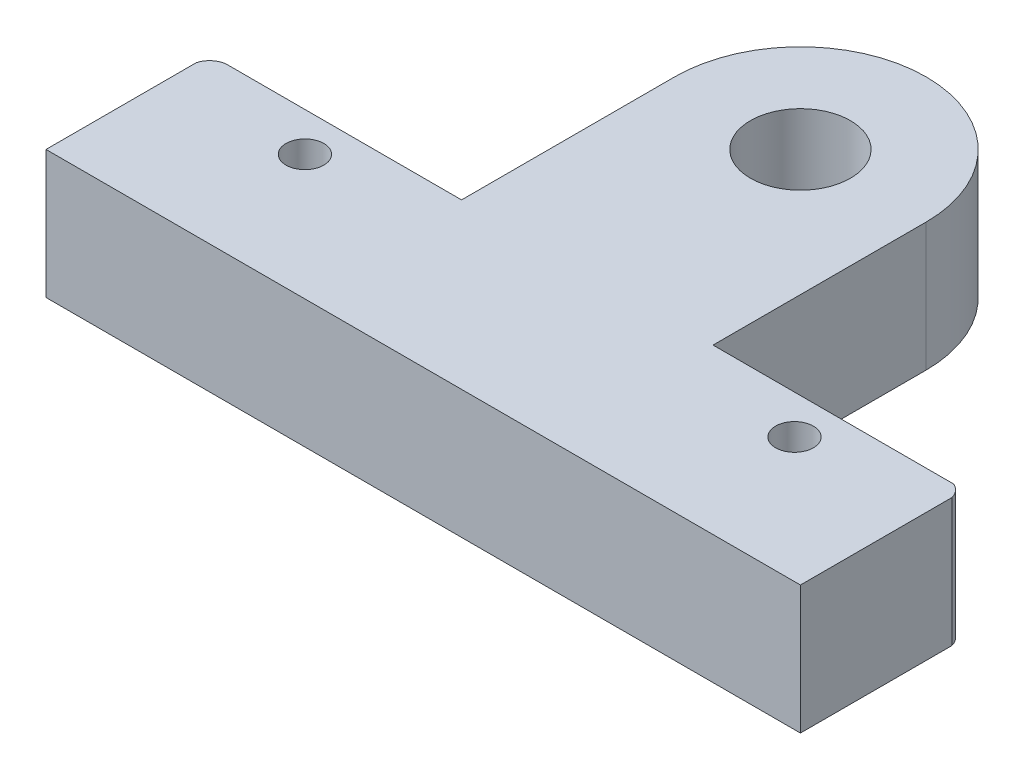
ISO-10303-21;
HEADER;
FILE_DESCRIPTION(('STEP AP214'),'2;1');
FILE_NAME('part.step','',(''),(''),'','','');
FILE_SCHEMA(('AUTOMOTIVE_DESIGN { 1 0 10303 214 1 1 1 1 }'));
ENDSEC;
DATA;
#1=APPLICATION_CONTEXT('core data for automotive mechanical design processes');
#2=APPLICATION_PROTOCOL_DEFINITION('international standard','automotive_design',2000,#1);
#3=PRODUCT_CONTEXT('',#1,'mechanical');
#4=PRODUCT('Part','Part','',(#3));
#5=PRODUCT_RELATED_PRODUCT_CATEGORY('part','',(#4));
#6=PRODUCT_DEFINITION_FORMATION('','',#4);
#7=PRODUCT_DEFINITION_CONTEXT('part definition',#1,'design');
#8=PRODUCT_DEFINITION('design','',#6,#7);
#9=PRODUCT_DEFINITION_SHAPE('','',#8);
#10=(LENGTH_UNIT() NAMED_UNIT(*) SI_UNIT(.MILLI.,.METRE.));
#11=(NAMED_UNIT(*) PLANE_ANGLE_UNIT() SI_UNIT($,.RADIAN.));
#12=(NAMED_UNIT(*) SI_UNIT($,.STERADIAN.) SOLID_ANGLE_UNIT());
#13=UNCERTAINTY_MEASURE_WITH_UNIT(LENGTH_MEASURE(1.E-05),#10,'distance_accuracy_value','');
#14=(GEOMETRIC_REPRESENTATION_CONTEXT(3) GLOBAL_UNCERTAINTY_ASSIGNED_CONTEXT((#13)) GLOBAL_UNIT_ASSIGNED_CONTEXT((#10,
#11,#12)) REPRESENTATION_CONTEXT('',''));
#15=CARTESIAN_POINT('',(0.,0.,0.));
#16=DIRECTION('',(0.,0.,1.));
#17=DIRECTION('',(1.,0.,0.));
#18=AXIS2_PLACEMENT_3D('',#15,#16,#17);
#19=CARTESIAN_POINT('',(-33.9151643210833,10.2,-4.9982712065841));
#20=DIRECTION('',(0.,1.,0.));
#21=DIRECTION('',(0.,0.,1.));
#22=AXIS2_PLACEMENT_3D('',#19,#20,#21);
#23=PLANE('',#22);
#24=CARTESIAN_POINT('',(-24.7332591568358,10.2,-3.39802172551698));
#25=DIRECTION('',(0.,1.,0.));
#26=DIRECTION('',(0.,0.,1.));
#27=AXIS2_PLACEMENT_3D('',#24,#25,#26);
#28=CIRCLE('',#27,1.5);
#29=CARTESIAN_POINT('',(-24.7332591568358,10.2,-1.89802172551698));
#30=VERTEX_POINT('',#29);
#31=EDGE_CURVE('E211',#30,#30,#28,.T.);
#32=ORIENTED_EDGE('',*,*,#31,.F.);
#33=EDGE_LOOP('',(#32));
#34=FACE_BOUND('',#33,.T.);
#35=DIRECTION('',(0.,0.,-1.));
#36=VECTOR('',#35,1.);
#37=CARTESIAN_POINT('',(24.6359204359297,10.2,-5.48463370746509));
#38=LINE('',#37,#36);
#39=CARTESIAN_POINT('',(24.6359204359297,10.2,6.563308932001));
#40=VERTEX_POINT('',#39);
#41=CARTESIAN_POINT('',(24.6359204359297,10.2,-5.48463370746509));
#42=VERTEX_POINT('',#41);
#43=EDGE_CURVE('E160',#40,#42,#38,.T.);
#44=ORIENTED_EDGE('',*,*,#43,.T.);
#45=CARTESIAN_POINT('',(23.1848097047454,10.2,-5.10479473389651));
#46=DIRECTION('',(0.,1.,0.));
#47=DIRECTION('',(0.,0.,1.));
#48=AXIS2_PLACEMENT_3D('',#45,#46,#47);
#49=CIRCLE('',#48,1.5);
#50=CARTESIAN_POINT('',(23.7685858672969,10.2,-6.48653472102745));
#51=VERTEX_POINT('',#50);
#52=EDGE_CURVE('E98',#42,#51,#49,.T.);
#53=ORIENTED_EDGE('',*,*,#52,.T.);
#54=DIRECTION('',(-1.,0.,0.));
#55=VECTOR('',#54,1.);
#56=CARTESIAN_POINT('',(4.63592043592972,10.2,-6.48653472102745));
#57=LINE('',#56,#55);
#58=CARTESIAN_POINT('',(4.63592043592972,10.2,-6.48653472102745));
#59=VERTEX_POINT('',#58);
#60=EDGE_CURVE('E181',#51,#59,#57,.T.);
#61=ORIENTED_EDGE('',*,*,#60,.T.);
#62=DIRECTION('',(0.,0.,-1.));
#63=VECTOR('',#62,1.);
#64=CARTESIAN_POINT('',(4.63592043592972,10.2,-6.48653472102745));
#65=LINE('',#64,#63);
#66=CARTESIAN_POINT('',(4.63592043592972,10.2,-23.436691067999));
#67=VERTEX_POINT('',#66);
#68=EDGE_CURVE('E200',#59,#67,#65,.T.);
#69=ORIENTED_EDGE('',*,*,#68,.T.);
#70=CARTESIAN_POINT('',(-5.36407956407028,10.2,-23.436691067999));
#71=DIRECTION('',(0.,1.,0.));
#72=DIRECTION('',(0.,0.,1.));
#73=AXIS2_PLACEMENT_3D('',#70,#71,#72);
#74=CIRCLE('',#73,10.);
#75=CARTESIAN_POINT('',(-15.3640795640703,10.2,-23.436691067999));
#76=VERTEX_POINT('',#75);
#77=EDGE_CURVE('E197',#67,#76,#74,.T.);
#78=ORIENTED_EDGE('',*,*,#77,.T.);
#79=DIRECTION('',(0.,0.,1.));
#80=VECTOR('',#79,1.);
#81=CARTESIAN_POINT('',(-15.3640795640703,10.2,-6.48653472102745));
#82=LINE('',#81,#80);
#83=CARTESIAN_POINT('',(-15.3640795640703,10.2,-6.48653472102745));
#84=VERTEX_POINT('',#83);
#85=EDGE_CURVE('E199',#76,#84,#82,.T.);
#86=ORIENTED_EDGE('',*,*,#85,.T.);
#87=DIRECTION('',(-1.,0.,0.));
#88=VECTOR('',#87,1.);
#89=CARTESIAN_POINT('',(-34.1024387496012,10.2,-6.48653472102745));
#90=LINE('',#89,#88);
#91=CARTESIAN_POINT('',(-34.1024387496012,10.2,-6.48653472102745));
#92=VERTEX_POINT('',#91);
#93=EDGE_CURVE('E123',#84,#92,#90,.T.);
#94=ORIENTED_EDGE('',*,*,#93,.T.);
#95=CARTESIAN_POINT('',(-33.9151643210833,10.2,-4.9982712065841));
#96=DIRECTION('',(0.,1.,0.));
#97=DIRECTION('',(0.,0.,1.));
#98=AXIS2_PLACEMENT_3D('',#95,#96,#97);
#99=CIRCLE('',#98,1.5);
#100=CARTESIAN_POINT('',(-35.3640795640703,10.2,-5.38640084812138));
#101=VERTEX_POINT('',#100);
#102=EDGE_CURVE('E117',#92,#101,#99,.T.);
#103=ORIENTED_EDGE('',*,*,#102,.T.);
#104=DIRECTION('',(0.,0.,1.));
#105=VECTOR('',#104,1.);
#106=CARTESIAN_POINT('',(-35.3640795640703,10.2,-5.38640084812138));
#107=LINE('',#106,#105);
#108=CARTESIAN_POINT('',(-35.3640795640703,10.2,6.563308932001));
#109=VERTEX_POINT('',#108);
#110=EDGE_CURVE('E121',#101,#109,#107,.T.);
#111=ORIENTED_EDGE('',*,*,#110,.T.);
#112=DIRECTION('',(1.,0.,0.));
#113=VECTOR('',#112,1.);
#114=CARTESIAN_POINT('',(-35.3640795640703,10.2,6.563308932001));
#115=LINE('',#114,#113);
#116=EDGE_CURVE('E49',#109,#40,#115,.T.);
#117=ORIENTED_EDGE('',*,*,#116,.T.);
#118=EDGE_LOOP('',(#44,#53,#61,#69,#78,#86,#94,#103,#111,#117));
#119=FACE_BOUND('',#118,.T.);
#120=CARTESIAN_POINT('',(-5.36407956407028,10.2,-23.436691067999));
#121=DIRECTION('',(0.,1.,0.));
#122=DIRECTION('',(0.,0.,1.));
#123=AXIS2_PLACEMENT_3D('',#120,#121,#122);
#124=CIRCLE('',#123,3.975);
#125=CARTESIAN_POINT('',(-5.36407956407028,10.2,-19.461691067999));
#126=VERTEX_POINT('',#125);
#127=EDGE_CURVE('E145',#126,#126,#124,.T.);
#128=ORIENTED_EDGE('',*,*,#127,.F.);
#129=EDGE_LOOP('',(#128));
#130=FACE_BOUND('',#129,.T.);
#131=CARTESIAN_POINT('',(14.2022531516133,10.2,-3.39802172551698));
#132=DIRECTION('',(0.,1.,0.));
#133=DIRECTION('',(0.,0.,1.));
#134=AXIS2_PLACEMENT_3D('',#131,#132,#133);
#135=CIRCLE('',#134,1.5);
#136=CARTESIAN_POINT('',(14.2022531516133,10.2,-1.89802172551698));
#137=VERTEX_POINT('',#136);
#138=EDGE_CURVE('E217',#137,#137,#135,.T.);
#139=ORIENTED_EDGE('',*,*,#138,.F.);
#140=EDGE_LOOP('',(#139));
#141=FACE_BOUND('',#140,.T.);
#142=ADVANCED_FACE('F32',(#34,#119,#130,#141),#23,.T.);
#143=CARTESIAN_POINT('',(-33.9151643210833,0.,-4.9982712065841));
#144=DIRECTION('',(0.,1.,0.));
#145=DIRECTION('',(0.,0.,1.));
#146=AXIS2_PLACEMENT_3D('',#143,#144,#145);
#147=PLANE('',#146);
#148=CARTESIAN_POINT('',(-24.7332591568358,0.,-3.39802172551698));
#149=DIRECTION('',(0.,1.,0.));
#150=DIRECTION('',(0.,0.,1.));
#151=AXIS2_PLACEMENT_3D('',#148,#149,#150);
#152=CIRCLE('',#151,1.5);
#153=CARTESIAN_POINT('',(-24.7332591568358,0.,-1.89802172551698));
#154=VERTEX_POINT('',#153);
#155=EDGE_CURVE('E214',#154,#154,#152,.T.);
#156=ORIENTED_EDGE('',*,*,#155,.T.);
#157=EDGE_LOOP('',(#156));
#158=FACE_BOUND('',#157,.T.);
#159=DIRECTION('',(0.,0.,-1.));
#160=VECTOR('',#159,1.);
#161=CARTESIAN_POINT('',(24.6359204359297,0.,-5.48463370746509));
#162=LINE('',#161,#160);
#163=CARTESIAN_POINT('',(24.6359204359297,0.,6.563308932001));
#164=VERTEX_POINT('',#163);
#165=CARTESIAN_POINT('',(24.6359204359297,0.,-5.48463370746509));
#166=VERTEX_POINT('',#165);
#167=EDGE_CURVE('E141',#164,#166,#162,.T.);
#168=ORIENTED_EDGE('',*,*,#167,.F.);
#169=DIRECTION('',(1.,0.,0.));
#170=VECTOR('',#169,1.);
#171=CARTESIAN_POINT('',(-35.3640795640703,0.,6.563308932001));
#172=LINE('',#171,#170);
#173=CARTESIAN_POINT('',(-35.3640795640703,0.,6.563308932001));
#174=VERTEX_POINT('',#173);
#175=EDGE_CURVE('E90',#174,#164,#172,.T.);
#176=ORIENTED_EDGE('',*,*,#175,.F.);
#177=DIRECTION('',(0.,0.,1.));
#178=VECTOR('',#177,1.);
#179=CARTESIAN_POINT('',(-35.3640795640703,0.,-5.38640084812138));
#180=LINE('',#179,#178);
#181=CARTESIAN_POINT('',(-35.3640795640703,0.,-5.38640084812138));
#182=VERTEX_POINT('',#181);
#183=EDGE_CURVE('E84',#182,#174,#180,.T.);
#184=ORIENTED_EDGE('',*,*,#183,.F.);
#185=CARTESIAN_POINT('',(-33.9151643210833,0.,-4.9982712065841));
#186=DIRECTION('',(0.,1.,0.));
#187=DIRECTION('',(0.,0.,1.));
#188=AXIS2_PLACEMENT_3D('',#185,#186,#187);
#189=CIRCLE('',#188,1.5);
#190=CARTESIAN_POINT('',(-34.1024387496012,0.,-6.48653472102745));
#191=VERTEX_POINT('',#190);
#192=EDGE_CURVE('E131',#191,#182,#189,.T.);
#193=ORIENTED_EDGE('',*,*,#192,.F.);
#194=DIRECTION('',(-1.,0.,0.));
#195=VECTOR('',#194,1.);
#196=CARTESIAN_POINT('',(-34.1024387496012,0.,-6.48653472102745));
#197=LINE('',#196,#195);
#198=CARTESIAN_POINT('',(-15.3640795640703,0.,-6.48653472102745));
#199=VERTEX_POINT('',#198);
#200=EDGE_CURVE('E155',#199,#191,#197,.T.);
#201=ORIENTED_EDGE('',*,*,#200,.F.);
#202=DIRECTION('',(0.,0.,1.));
#203=VECTOR('',#202,1.);
#204=CARTESIAN_POINT('',(-15.3640795640703,0.,-6.48653472102745));
#205=LINE('',#204,#203);
#206=CARTESIAN_POINT('',(-15.3640795640703,0.,-23.436691067999));
#207=VERTEX_POINT('',#206);
#208=EDGE_CURVE('E153',#207,#199,#205,.T.);
#209=ORIENTED_EDGE('',*,*,#208,.F.);
#210=CARTESIAN_POINT('',(-5.36407956407028,0.,-23.436691067999));
#211=DIRECTION('',(0.,1.,0.));
#212=DIRECTION('',(0.,0.,1.));
#213=AXIS2_PLACEMENT_3D('',#210,#211,#212);
#214=CIRCLE('',#213,10.);
#215=CARTESIAN_POINT('',(4.63592043592972,0.,-23.436691067999));
#216=VERTEX_POINT('',#215);
#217=EDGE_CURVE('E151',#216,#207,#214,.T.);
#218=ORIENTED_EDGE('',*,*,#217,.F.);
#219=DIRECTION('',(0.,0.,-1.));
#220=VECTOR('',#219,1.);
#221=CARTESIAN_POINT('',(4.63592043592972,0.,-6.48653472102745));
#222=LINE('',#221,#220);
#223=CARTESIAN_POINT('',(4.63592043592972,0.,-6.48653472102745));
#224=VERTEX_POINT('',#223);
#225=EDGE_CURVE('E149',#224,#216,#222,.T.);
#226=ORIENTED_EDGE('',*,*,#225,.F.);
#227=DIRECTION('',(-1.,0.,0.));
#228=VECTOR('',#227,1.);
#229=CARTESIAN_POINT('',(4.63592043592972,0.,-6.48653472102745));
#230=LINE('',#229,#228);
#231=CARTESIAN_POINT('',(23.7685858672969,0.,-6.48653472102745));
#232=VERTEX_POINT('',#231);
#233=EDGE_CURVE('E147',#232,#224,#230,.T.);
#234=ORIENTED_EDGE('',*,*,#233,.F.);
#235=CARTESIAN_POINT('',(23.1848097047454,0.,-5.10479473389651));
#236=DIRECTION('',(0.,1.,0.));
#237=DIRECTION('',(0.,0.,1.));
#238=AXIS2_PLACEMENT_3D('',#235,#236,#237);
#239=CIRCLE('',#238,1.5);
#240=EDGE_CURVE('E144',#166,#232,#239,.T.);
#241=ORIENTED_EDGE('',*,*,#240,.F.);
#242=EDGE_LOOP('',(#168,#176,#184,#193,#201,#209,#218,#226,#234,#241));
#243=FACE_BOUND('',#242,.T.);
#244=CARTESIAN_POINT('',(-5.36407956407028,0.,-23.436691067999));
#245=DIRECTION('',(0.,1.,0.));
#246=DIRECTION('',(0.,0.,1.));
#247=AXIS2_PLACEMENT_3D('',#244,#245,#246);
#248=CIRCLE('',#247,3.975);
#249=CARTESIAN_POINT('',(-5.36407956407028,0.,-19.461691067999));
#250=VERTEX_POINT('',#249);
#251=EDGE_CURVE('E208',#250,#250,#248,.T.);
#252=ORIENTED_EDGE('',*,*,#251,.T.);
#253=EDGE_LOOP('',(#252));
#254=FACE_BOUND('',#253,.T.);
#255=CARTESIAN_POINT('',(14.2022531516133,0.,-3.39802172551698));
#256=DIRECTION('',(0.,1.,0.));
#257=DIRECTION('',(0.,0.,1.));
#258=AXIS2_PLACEMENT_3D('',#255,#256,#257);
#259=CIRCLE('',#258,1.5);
#260=CARTESIAN_POINT('',(14.2022531516133,0.,-1.89802172551698));
#261=VERTEX_POINT('',#260);
#262=EDGE_CURVE('E220',#261,#261,#259,.T.);
#263=ORIENTED_EDGE('',*,*,#262,.T.);
#264=EDGE_LOOP('',(#263));
#265=FACE_BOUND('',#264,.T.);
#266=ADVANCED_FACE('F185',(#158,#243,#254,#265),#147,.F.);
#267=CARTESIAN_POINT('',(24.6359204359297,10.2,-5.48463370746509));
#268=DIRECTION('',(-1.,0.,0.));
#269=DIRECTION('',(0.,0.,1.));
#270=AXIS2_PLACEMENT_3D('',#267,#268,#269);
#271=PLANE('',#270);
#272=ORIENTED_EDGE('',*,*,#167,.T.);
#273=DIRECTION('',(0.,-1.,0.));
#274=VECTOR('',#273,1.);
#275=CARTESIAN_POINT('',(24.6359204359297,10.2,-5.48463370746509));
#276=LINE('',#275,#274);
#277=EDGE_CURVE('E11',#42,#166,#276,.T.);
#278=ORIENTED_EDGE('',*,*,#277,.F.);
#279=ORIENTED_EDGE('',*,*,#43,.F.);
#280=DIRECTION('',(0.,-1.,0.));
#281=VECTOR('',#280,1.);
#282=CARTESIAN_POINT('',(24.6359204359297,10.2,6.563308932001));
#283=LINE('',#282,#281);
#284=EDGE_CURVE('E137',#40,#164,#283,.T.);
#285=ORIENTED_EDGE('',*,*,#284,.T.);
#286=EDGE_LOOP('',(#272,#278,#279,#285));
#287=FACE_BOUND('',#286,.T.);
#288=ADVANCED_FACE('F34',(#287),#271,.F.);
#289=CARTESIAN_POINT('',(23.1848097047454,10.2,-5.10479473389651));
#290=DIRECTION('',(0.,-1.,0.));
#291=DIRECTION('',(0.,0.,-1.));
#292=AXIS2_PLACEMENT_3D('',#289,#290,#291);
#293=CYLINDRICAL_SURFACE('',#292,1.5);
#294=ORIENTED_EDGE('',*,*,#240,.T.);
#295=DIRECTION('',(0.,-1.,0.));
#296=VECTOR('',#295,1.);
#297=CARTESIAN_POINT('',(23.7685858672969,10.2,-6.48653472102745));
#298=LINE('',#297,#296);
#299=EDGE_CURVE('E41',#51,#232,#298,.T.);
#300=ORIENTED_EDGE('',*,*,#299,.F.);
#301=ORIENTED_EDGE('',*,*,#52,.F.);
#302=ORIENTED_EDGE('',*,*,#277,.T.);
#303=EDGE_LOOP('',(#294,#300,#301,#302));
#304=FACE_BOUND('',#303,.T.);
#305=ADVANCED_FACE('F262',(#304),#293,.T.);
#306=CARTESIAN_POINT('',(4.63592043592972,10.2,-6.48653472102745));
#307=DIRECTION('',(0.,0.,1.));
#308=DIRECTION('',(1.,0.,0.));
#309=AXIS2_PLACEMENT_3D('',#306,#307,#308);
#310=PLANE('',#309);
#311=ORIENTED_EDGE('',*,*,#233,.T.);
#312=DIRECTION('',(0.,-1.,0.));
#313=VECTOR('',#312,1.);
#314=CARTESIAN_POINT('',(4.63592043592972,10.2,-6.48653472102745));
#315=LINE('',#314,#313);
#316=EDGE_CURVE('E173',#59,#224,#315,.T.);
#317=ORIENTED_EDGE('',*,*,#316,.F.);
#318=ORIENTED_EDGE('',*,*,#60,.F.);
#319=ORIENTED_EDGE('',*,*,#299,.T.);
#320=EDGE_LOOP('',(#311,#317,#318,#319));
#321=FACE_BOUND('',#320,.T.);
#322=ADVANCED_FACE('F179',(#321),#310,.F.);
#323=CARTESIAN_POINT('',(4.63592043592972,10.2,-6.48653472102745));
#324=DIRECTION('',(-1.,0.,0.));
#325=DIRECTION('',(0.,0.,1.));
#326=AXIS2_PLACEMENT_3D('',#323,#324,#325);
#327=PLANE('',#326);
#328=ORIENTED_EDGE('',*,*,#225,.T.);
#329=DIRECTION('',(0.,-1.,0.));
#330=VECTOR('',#329,1.);
#331=CARTESIAN_POINT('',(4.63592043592972,10.2,-23.436691067999));
#332=LINE('',#331,#330);
#333=EDGE_CURVE('E170',#67,#216,#332,.T.);
#334=ORIENTED_EDGE('',*,*,#333,.F.);
#335=ORIENTED_EDGE('',*,*,#68,.F.);
#336=ORIENTED_EDGE('',*,*,#316,.T.);
#337=EDGE_LOOP('',(#328,#334,#335,#336));
#338=FACE_BOUND('',#337,.T.);
#339=ADVANCED_FACE('F191',(#338),#327,.F.);
#340=CARTESIAN_POINT('',(-5.36407956407028,10.2,-23.436691067999));
#341=DIRECTION('',(0.,-1.,0.));
#342=DIRECTION('',(0.,0.,-1.));
#343=AXIS2_PLACEMENT_3D('',#340,#341,#342);
#344=CYLINDRICAL_SURFACE('',#343,10.);
#345=ORIENTED_EDGE('',*,*,#217,.T.);
#346=DIRECTION('',(0.,-1.,0.));
#347=VECTOR('',#346,1.);
#348=CARTESIAN_POINT('',(-15.3640795640703,10.2,-23.436691067999));
#349=LINE('',#348,#347);
#350=EDGE_CURVE('E167',#76,#207,#349,.T.);
#351=ORIENTED_EDGE('',*,*,#350,.F.);
#352=ORIENTED_EDGE('',*,*,#77,.F.);
#353=ORIENTED_EDGE('',*,*,#333,.T.);
#354=EDGE_LOOP('',(#345,#351,#352,#353));
#355=FACE_BOUND('',#354,.T.);
#356=ADVANCED_FACE('F195',(#355),#344,.T.);
#357=CARTESIAN_POINT('',(-15.3640795640703,10.2,-6.48653472102745));
#358=DIRECTION('',(1.,0.,0.));
#359=DIRECTION('',(0.,0.,-1.));
#360=AXIS2_PLACEMENT_3D('',#357,#358,#359);
#361=PLANE('',#360);
#362=ORIENTED_EDGE('',*,*,#208,.T.);
#363=DIRECTION('',(0.,-1.,0.));
#364=VECTOR('',#363,1.);
#365=CARTESIAN_POINT('',(-15.3640795640703,10.2,-6.48653472102745));
#366=LINE('',#365,#364);
#367=EDGE_CURVE('E164',#84,#199,#366,.T.);
#368=ORIENTED_EDGE('',*,*,#367,.F.);
#369=ORIENTED_EDGE('',*,*,#85,.F.);
#370=ORIENTED_EDGE('',*,*,#350,.T.);
#371=EDGE_LOOP('',(#362,#368,#369,#370));
#372=FACE_BOUND('',#371,.T.);
#373=ADVANCED_FACE('F252',(#372),#361,.F.);
#374=CARTESIAN_POINT('',(-34.1024387496012,10.2,-6.48653472102745));
#375=DIRECTION('',(0.,0.,1.));
#376=DIRECTION('',(1.,0.,0.));
#377=AXIS2_PLACEMENT_3D('',#374,#375,#376);
#378=PLANE('',#377);
#379=ORIENTED_EDGE('',*,*,#200,.T.);
#380=DIRECTION('',(0.,-1.,0.));
#381=VECTOR('',#380,1.);
#382=CARTESIAN_POINT('',(-34.1024387496012,10.2,-6.48653472102745));
#383=LINE('',#382,#381);
#384=EDGE_CURVE('E132',#92,#191,#383,.T.);
#385=ORIENTED_EDGE('',*,*,#384,.F.);
#386=ORIENTED_EDGE('',*,*,#93,.F.);
#387=ORIENTED_EDGE('',*,*,#367,.T.);
#388=EDGE_LOOP('',(#379,#385,#386,#387));
#389=FACE_BOUND('',#388,.T.);
#390=ADVANCED_FACE('F249',(#389),#378,.F.);
#391=CARTESIAN_POINT('',(-33.9151643210833,10.2,-4.9982712065841));
#392=DIRECTION('',(0.,-1.,0.));
#393=DIRECTION('',(0.,0.,-1.));
#394=AXIS2_PLACEMENT_3D('',#391,#392,#393);
#395=CYLINDRICAL_SURFACE('',#394,1.5);
#396=ORIENTED_EDGE('',*,*,#192,.T.);
#397=DIRECTION('',(0.,-1.,0.));
#398=VECTOR('',#397,1.);
#399=CARTESIAN_POINT('',(-35.3640795640703,10.2,-5.38640084812138));
#400=LINE('',#399,#398);
#401=EDGE_CURVE('E128',#101,#182,#400,.T.);
#402=ORIENTED_EDGE('',*,*,#401,.F.);
#403=ORIENTED_EDGE('',*,*,#102,.F.);
#404=ORIENTED_EDGE('',*,*,#384,.T.);
#405=EDGE_LOOP('',(#396,#402,#403,#404));
#406=FACE_BOUND('',#405,.T.);
#407=ADVANCED_FACE('F129',(#406),#395,.T.);
#408=CARTESIAN_POINT('',(-35.3640795640703,10.2,-5.38640084812138));
#409=DIRECTION('',(1.,0.,0.));
#410=DIRECTION('',(0.,0.,-1.));
#411=AXIS2_PLACEMENT_3D('',#408,#409,#410);
#412=PLANE('',#411);
#413=ORIENTED_EDGE('',*,*,#183,.T.);
#414=DIRECTION('',(0.,-1.,0.));
#415=VECTOR('',#414,1.);
#416=CARTESIAN_POINT('',(-35.3640795640703,10.2,6.563308932001));
#417=LINE('',#416,#415);
#418=EDGE_CURVE('E133',#109,#174,#417,.T.);
#419=ORIENTED_EDGE('',*,*,#418,.F.);
#420=ORIENTED_EDGE('',*,*,#110,.F.);
#421=ORIENTED_EDGE('',*,*,#401,.T.);
#422=EDGE_LOOP('',(#413,#419,#420,#421));
#423=FACE_BOUND('',#422,.T.);
#424=ADVANCED_FACE('F135',(#423),#412,.F.);
#425=CARTESIAN_POINT('',(-35.3640795640703,10.2,6.563308932001));
#426=DIRECTION('',(0.,0.,-1.));
#427=DIRECTION('',(-1.,0.,0.));
#428=AXIS2_PLACEMENT_3D('',#425,#426,#427);
#429=PLANE('',#428);
#430=ORIENTED_EDGE('',*,*,#175,.T.);
#431=ORIENTED_EDGE('',*,*,#284,.F.);
#432=ORIENTED_EDGE('',*,*,#116,.F.);
#433=ORIENTED_EDGE('',*,*,#418,.T.);
#434=EDGE_LOOP('',(#430,#431,#432,#433));
#435=FACE_BOUND('',#434,.T.);
#436=ADVANCED_FACE('F242',(#435),#429,.F.);
#437=CARTESIAN_POINT('',(-5.36407956407028,10.2,-23.436691067999));
#438=DIRECTION('',(0.,-1.,0.));
#439=DIRECTION('',(0.,0.,-1.));
#440=AXIS2_PLACEMENT_3D('',#437,#438,#439);
#441=CYLINDRICAL_SURFACE('',#440,3.975);
#442=ORIENTED_EDGE('',*,*,#127,.T.);
#443=EDGE_LOOP('',(#442));
#444=FACE_BOUND('',#443,.T.);
#445=ORIENTED_EDGE('',*,*,#251,.F.);
#446=EDGE_LOOP('',(#445));
#447=FACE_BOUND('',#446,.T.);
#448=ADVANCED_FACE('F239',(#444,#447),#441,.F.);
#449=CARTESIAN_POINT('',(-24.7332591568358,10.2,-3.39802172551698));
#450=DIRECTION('',(0.,-1.,0.));
#451=DIRECTION('',(0.,0.,-1.));
#452=AXIS2_PLACEMENT_3D('',#449,#450,#451);
#453=CYLINDRICAL_SURFACE('',#452,1.5);
#454=ORIENTED_EDGE('',*,*,#31,.T.);
#455=EDGE_LOOP('',(#454));
#456=FACE_BOUND('',#455,.T.);
#457=ORIENTED_EDGE('',*,*,#155,.F.);
#458=EDGE_LOOP('',(#457));
#459=FACE_BOUND('',#458,.T.);
#460=ADVANCED_FACE('F338',(#456,#459),#453,.F.);
#461=CARTESIAN_POINT('',(14.2022531516133,10.2,-3.39802172551698));
#462=DIRECTION('',(0.,-1.,0.));
#463=DIRECTION('',(0.,0.,-1.));
#464=AXIS2_PLACEMENT_3D('',#461,#462,#463);
#465=CYLINDRICAL_SURFACE('',#464,1.5);
#466=ORIENTED_EDGE('',*,*,#138,.T.);
#467=EDGE_LOOP('',(#466));
#468=FACE_BOUND('',#467,.T.);
#469=ORIENTED_EDGE('',*,*,#262,.F.);
#470=EDGE_LOOP('',(#469));
#471=FACE_BOUND('',#470,.T.);
#472=ADVANCED_FACE('F226',(#468,#471),#465,.F.);
#473=CLOSED_SHELL('',(#142,#266,#288,#305,#322,#339,#356,#373,#390,#407,#424,#436,#448,#460,#472));
#474=MANIFOLD_SOLID_BREP('B2',#473);
#475=ADVANCED_BREP_SHAPE_REPRESENTATION('',(#18,#474),#14);
#476=SHAPE_DEFINITION_REPRESENTATION(#9,#475);
ENDSEC;
END-ISO-10303-21;
